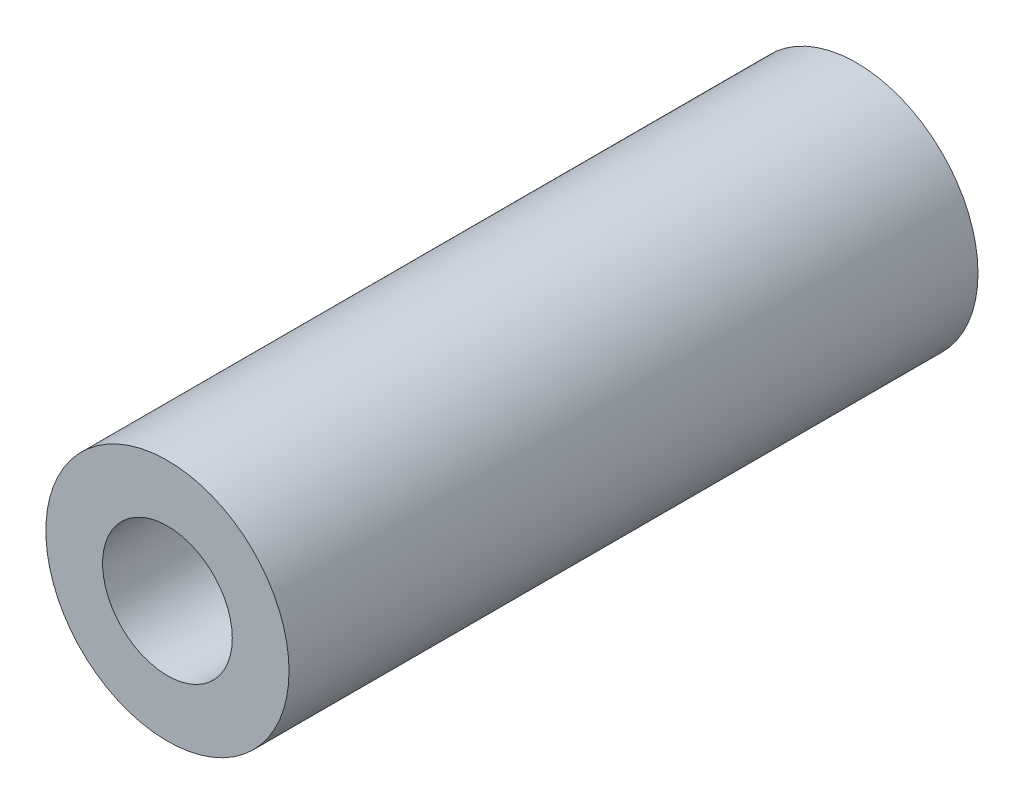
ISO-10303-21;
HEADER;
FILE_DESCRIPTION(('STEP AP214'),'2;1');
FILE_NAME('part.step','',(''),(''),'','','');
FILE_SCHEMA(('AUTOMOTIVE_DESIGN { 1 0 10303 214 1 1 1 1 }'));
ENDSEC;
DATA;
#1=APPLICATION_CONTEXT('core data for automotive mechanical design processes');
#2=APPLICATION_PROTOCOL_DEFINITION('international standard','automotive_design',2000,#1);
#3=PRODUCT_CONTEXT('',#1,'mechanical');
#4=PRODUCT('Part','Part','',(#3));
#5=PRODUCT_RELATED_PRODUCT_CATEGORY('part','',(#4));
#6=PRODUCT_DEFINITION_FORMATION('','',#4);
#7=PRODUCT_DEFINITION_CONTEXT('part definition',#1,'design');
#8=PRODUCT_DEFINITION('design','',#6,#7);
#9=PRODUCT_DEFINITION_SHAPE('','',#8);
#10=(LENGTH_UNIT() NAMED_UNIT(*) SI_UNIT(.MILLI.,.METRE.));
#11=(NAMED_UNIT(*) PLANE_ANGLE_UNIT() SI_UNIT($,.RADIAN.));
#12=(NAMED_UNIT(*) SI_UNIT($,.STERADIAN.) SOLID_ANGLE_UNIT());
#13=UNCERTAINTY_MEASURE_WITH_UNIT(LENGTH_MEASURE(1.E-05),#10,'distance_accuracy_value','');
#14=(GEOMETRIC_REPRESENTATION_CONTEXT(3) GLOBAL_UNCERTAINTY_ASSIGNED_CONTEXT((#13)) GLOBAL_UNIT_ASSIGNED_CONTEXT((#10,
#11,#12)) REPRESENTATION_CONTEXT('',''));
#15=CARTESIAN_POINT('',(0.,0.,0.));
#16=DIRECTION('',(0.,0.,1.));
#17=DIRECTION('',(1.,0.,0.));
#18=AXIS2_PLACEMENT_3D('',#15,#16,#17);
#19=CARTESIAN_POINT('',(0.,0.,8.5));
#20=DIRECTION('',(0.,0.,1.));
#21=DIRECTION('',(1.,0.,0.));
#22=AXIS2_PLACEMENT_3D('',#19,#20,#21);
#23=PLANE('',#22);
#24=CARTESIAN_POINT('',(0.,0.,8.5));
#25=DIRECTION('',(0.,0.,1.));
#26=DIRECTION('',(1.,0.,0.));
#27=AXIS2_PLACEMENT_3D('',#24,#25,#26);
#28=CIRCLE('',#27,3.);
#29=CARTESIAN_POINT('',(3.,0.,8.5));
#30=VERTEX_POINT('',#29);
#31=EDGE_CURVE('E10',#30,#30,#28,.T.);
#32=ORIENTED_EDGE('',*,*,#31,.T.);
#33=EDGE_LOOP('',(#32));
#34=FACE_BOUND('',#33,.T.);
#35=CARTESIAN_POINT('',(0.,0.,8.5));
#36=DIRECTION('',(0.,0.,1.));
#37=DIRECTION('',(1.,0.,0.));
#38=AXIS2_PLACEMENT_3D('',#35,#36,#37);
#39=CIRCLE('',#38,1.6);
#40=CARTESIAN_POINT('',(1.6,0.,8.5));
#41=VERTEX_POINT('',#40);
#42=EDGE_CURVE('E51',#41,#41,#39,.T.);
#43=ORIENTED_EDGE('',*,*,#42,.F.);
#44=EDGE_LOOP('',(#43));
#45=FACE_BOUND('',#44,.T.);
#46=ADVANCED_FACE('F37',(#34,#45),#23,.T.);
#47=CARTESIAN_POINT('',(0.,0.,-8.5));
#48=DIRECTION('',(0.,0.,1.));
#49=DIRECTION('',(1.,0.,0.));
#50=AXIS2_PLACEMENT_3D('',#47,#48,#49);
#51=PLANE('',#50);
#52=CARTESIAN_POINT('',(0.,0.,-8.5));
#53=DIRECTION('',(0.,0.,1.));
#54=DIRECTION('',(1.,0.,0.));
#55=AXIS2_PLACEMENT_3D('',#52,#53,#54);
#56=CIRCLE('',#55,3.);
#57=CARTESIAN_POINT('',(3.,0.,-8.5));
#58=VERTEX_POINT('',#57);
#59=EDGE_CURVE('E41',#58,#58,#56,.T.);
#60=ORIENTED_EDGE('',*,*,#59,.F.);
#61=EDGE_LOOP('',(#60));
#62=FACE_BOUND('',#61,.T.);
#63=CARTESIAN_POINT('',(0.,0.,-8.5));
#64=DIRECTION('',(0.,0.,1.));
#65=DIRECTION('',(1.,0.,0.));
#66=AXIS2_PLACEMENT_3D('',#63,#64,#65);
#67=CIRCLE('',#66,1.6);
#68=CARTESIAN_POINT('',(1.6,0.,-8.5));
#69=VERTEX_POINT('',#68);
#70=EDGE_CURVE('E53',#69,#69,#67,.T.);
#71=ORIENTED_EDGE('',*,*,#70,.T.);
#72=EDGE_LOOP('',(#71));
#73=FACE_BOUND('',#72,.T.);
#74=ADVANCED_FACE('F64',(#62,#73),#51,.F.);
#75=CARTESIAN_POINT('',(0.,0.,8.5));
#76=DIRECTION('',(0.,0.,-1.));
#77=DIRECTION('',(-1.,0.,0.));
#78=AXIS2_PLACEMENT_3D('',#75,#76,#77);
#79=CYLINDRICAL_SURFACE('',#78,3.);
#80=ORIENTED_EDGE('',*,*,#31,.F.);
#81=EDGE_LOOP('',(#80));
#82=FACE_BOUND('',#81,.T.);
#83=ORIENTED_EDGE('',*,*,#59,.T.);
#84=EDGE_LOOP('',(#83));
#85=FACE_BOUND('',#84,.T.);
#86=ADVANCED_FACE('F39',(#82,#85),#79,.T.);
#87=CARTESIAN_POINT('',(0.,0.,8.5));
#88=DIRECTION('',(0.,0.,-1.));
#89=DIRECTION('',(-1.,0.,0.));
#90=AXIS2_PLACEMENT_3D('',#87,#88,#89);
#91=CYLINDRICAL_SURFACE('',#90,1.6);
#92=ORIENTED_EDGE('',*,*,#42,.T.);
#93=EDGE_LOOP('',(#92));
#94=FACE_BOUND('',#93,.T.);
#95=ORIENTED_EDGE('',*,*,#70,.F.);
#96=EDGE_LOOP('',(#95));
#97=FACE_BOUND('',#96,.T.);
#98=ADVANCED_FACE('F60',(#94,#97),#91,.F.);
#99=CLOSED_SHELL('',(#46,#74,#86,#98));
#100=MANIFOLD_SOLID_BREP('B2',#99);
#101=ADVANCED_BREP_SHAPE_REPRESENTATION('',(#18,#100),#14);
#102=SHAPE_DEFINITION_REPRESENTATION(#9,#101);
ENDSEC;
END-ISO-10303-21;
